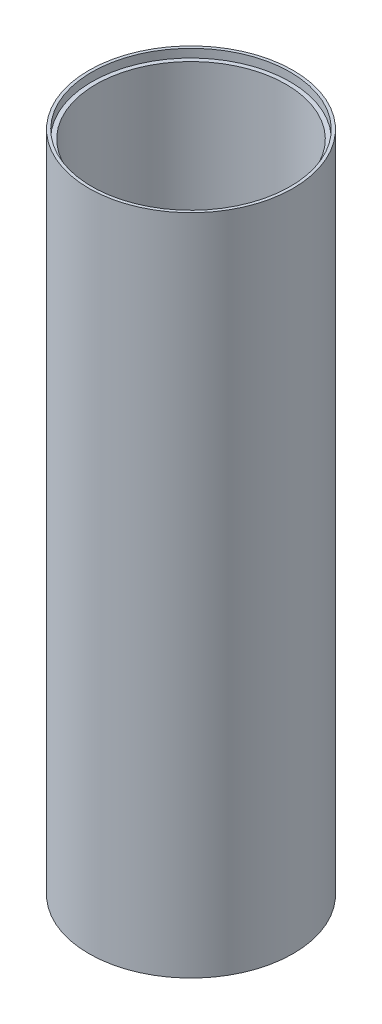
ISO-10303-21;
HEADER;
FILE_DESCRIPTION(('STEP AP214'),'2;1');
FILE_NAME('part.step','',(''),(''),'','','');
FILE_SCHEMA(('AUTOMOTIVE_DESIGN { 1 0 10303 214 1 1 1 1 }'));
ENDSEC;
DATA;
#1=APPLICATION_CONTEXT('core data for automotive mechanical design processes');
#2=APPLICATION_PROTOCOL_DEFINITION('international standard','automotive_design',2000,#1);
#3=PRODUCT_CONTEXT('',#1,'mechanical');
#4=PRODUCT('Part','Part','',(#3));
#5=PRODUCT_RELATED_PRODUCT_CATEGORY('part','',(#4));
#6=PRODUCT_DEFINITION_FORMATION('','',#4);
#7=PRODUCT_DEFINITION_CONTEXT('part definition',#1,'design');
#8=PRODUCT_DEFINITION('design','',#6,#7);
#9=PRODUCT_DEFINITION_SHAPE('','',#8);
#10=(LENGTH_UNIT() NAMED_UNIT(*) SI_UNIT(.MILLI.,.METRE.));
#11=(NAMED_UNIT(*) PLANE_ANGLE_UNIT() SI_UNIT($,.RADIAN.));
#12=(NAMED_UNIT(*) SI_UNIT($,.STERADIAN.) SOLID_ANGLE_UNIT());
#13=UNCERTAINTY_MEASURE_WITH_UNIT(LENGTH_MEASURE(1.E-05),#10,'distance_accuracy_value','');
#14=(GEOMETRIC_REPRESENTATION_CONTEXT(3) GLOBAL_UNCERTAINTY_ASSIGNED_CONTEXT((#13)) GLOBAL_UNIT_ASSIGNED_CONTEXT((#10,
#11,#12)) REPRESENTATION_CONTEXT('',''));
#15=CARTESIAN_POINT('',(0.,0.,0.));
#16=DIRECTION('',(0.,0.,1.));
#17=DIRECTION('',(1.,0.,0.));
#18=AXIS2_PLACEMENT_3D('',#15,#16,#17);
#19=CARTESIAN_POINT('',(0.,0.,0.));
#20=DIRECTION('',(0.,-1.,0.));
#21=DIRECTION('',(0.,0.,-1.));
#22=AXIS2_PLACEMENT_3D('',#19,#20,#21);
#23=PLANE('',#22);
#24=DIRECTION('',(-1.,0.,0.));
#25=VECTOR('',#24,1.);
#26=CARTESIAN_POINT('',(-3.175,0.,-3.175));
#27=LINE('',#26,#25);
#28=CARTESIAN_POINT('',(3.175,0.,-3.175));
#29=VERTEX_POINT('',#28);
#30=CARTESIAN_POINT('',(-3.175,0.,-3.175));
#31=VERTEX_POINT('',#30);
#32=EDGE_CURVE('E118',#29,#31,#27,.T.);
#33=ORIENTED_EDGE('',*,*,#32,.F.);
#34=DIRECTION('',(0.,0.,-1.));
#35=VECTOR('',#34,1.);
#36=CARTESIAN_POINT('',(3.175,0.,3.175));
#37=LINE('',#36,#35);
#38=CARTESIAN_POINT('',(3.175,0.,3.175));
#39=VERTEX_POINT('',#38);
#40=EDGE_CURVE('E58',#39,#29,#37,.T.);
#41=ORIENTED_EDGE('',*,*,#40,.F.);
#42=DIRECTION('',(1.,0.,0.));
#43=VECTOR('',#42,1.);
#44=CARTESIAN_POINT('',(-3.175,0.,3.175));
#45=LINE('',#44,#43);
#46=CARTESIAN_POINT('',(-3.175,0.,3.175));
#47=VERTEX_POINT('',#46);
#48=EDGE_CURVE('E105',#47,#39,#45,.T.);
#49=ORIENTED_EDGE('',*,*,#48,.F.);
#50=DIRECTION('',(0.,0.,1.));
#51=VECTOR('',#50,1.);
#52=CARTESIAN_POINT('',(-3.175,0.,3.175));
#53=LINE('',#52,#51);
#54=EDGE_CURVE('E109',#31,#47,#53,.T.);
#55=ORIENTED_EDGE('',*,*,#54,.F.);
#56=EDGE_LOOP('',(#33,#41,#49,#55));
#57=FACE_BOUND('',#56,.T.);
#58=CARTESIAN_POINT('',(0.,0.,0.));
#59=DIRECTION('',(0.,-1.,0.));
#60=DIRECTION('',(0.,0.,-1.));
#61=AXIS2_PLACEMENT_3D('',#58,#59,#60);
#62=CIRCLE('',#61,28.575);
#63=CARTESIAN_POINT('',(0.,0.,-28.575));
#64=VERTEX_POINT('',#63);
#65=EDGE_CURVE('E11',#64,#64,#62,.T.);
#66=ORIENTED_EDGE('',*,*,#65,.F.);
#67=EDGE_LOOP('',(#66));
#68=FACE_BOUND('',#67,.T.);
#69=ADVANCED_FACE('F43',(#57,#68),#23,.F.);
#70=CARTESIAN_POINT('',(0.,-6.35,0.));
#71=DIRECTION('',(0.,-1.,0.));
#72=DIRECTION('',(0.,0.,-1.));
#73=AXIS2_PLACEMENT_3D('',#70,#71,#72);
#74=CYLINDRICAL_SURFACE('',#73,28.575);
#75=CARTESIAN_POINT('',(0.,190.5,0.));
#76=DIRECTION('',(0.,-1.,0.));
#77=DIRECTION('',(0.,0.,-1.));
#78=AXIS2_PLACEMENT_3D('',#75,#76,#77);
#79=CIRCLE('',#78,28.575);
#80=CARTESIAN_POINT('',(0.,190.5,-28.575));
#81=VERTEX_POINT('',#80);
#82=EDGE_CURVE('E51',#81,#81,#79,.T.);
#83=ORIENTED_EDGE('',*,*,#82,.F.);
#84=EDGE_LOOP('',(#83));
#85=FACE_BOUND('',#84,.T.);
#86=ORIENTED_EDGE('',*,*,#65,.T.);
#87=EDGE_LOOP('',(#86));
#88=FACE_BOUND('',#87,.T.);
#89=ADVANCED_FACE('F153',(#85,#88),#74,.F.);
#90=CARTESIAN_POINT('',(-28.575,190.5,0.));
#91=DIRECTION('',(0.,-1.,0.));
#92=DIRECTION('',(0.,0.,-1.));
#93=AXIS2_PLACEMENT_3D('',#90,#91,#92);
#94=PLANE('',#93);
#95=CARTESIAN_POINT('',(0.,190.5,0.));
#96=DIRECTION('',(0.,-1.,0.));
#97=DIRECTION('',(0.,0.,-1.));
#98=AXIS2_PLACEMENT_3D('',#95,#96,#97);
#99=CIRCLE('',#98,29.845);
#100=CARTESIAN_POINT('',(0.,190.5,-29.845));
#101=VERTEX_POINT('',#100);
#102=EDGE_CURVE('E144',#101,#101,#99,.T.);
#103=ORIENTED_EDGE('',*,*,#102,.F.);
#104=EDGE_LOOP('',(#103));
#105=FACE_BOUND('',#104,.T.);
#106=ORIENTED_EDGE('',*,*,#82,.T.);
#107=EDGE_LOOP('',(#106));
#108=FACE_BOUND('',#107,.T.);
#109=ADVANCED_FACE('F151',(#105,#108),#94,.F.);
#110=CARTESIAN_POINT('',(0.,-6.35,0.));
#111=DIRECTION('',(0.,-1.,0.));
#112=DIRECTION('',(0.,0.,-1.));
#113=AXIS2_PLACEMENT_3D('',#110,#111,#112);
#114=CYLINDRICAL_SURFACE('',#113,29.845);
#115=CARTESIAN_POINT('',(0.,193.04,0.));
#116=DIRECTION('',(0.,-1.,0.));
#117=DIRECTION('',(0.,0.,-1.));
#118=AXIS2_PLACEMENT_3D('',#115,#116,#117);
#119=CIRCLE('',#118,29.845);
#120=CARTESIAN_POINT('',(0.,193.04,-29.845));
#121=VERTEX_POINT('',#120);
#122=EDGE_CURVE('E140',#121,#121,#119,.T.);
#123=ORIENTED_EDGE('',*,*,#122,.F.);
#124=EDGE_LOOP('',(#123));
#125=FACE_BOUND('',#124,.T.);
#126=ORIENTED_EDGE('',*,*,#102,.T.);
#127=EDGE_LOOP('',(#126));
#128=FACE_BOUND('',#127,.T.);
#129=ADVANCED_FACE('F187',(#125,#128),#114,.F.);
#130=CARTESIAN_POINT('',(-29.845,193.04,0.));
#131=DIRECTION('',(0.,-1.,0.));
#132=DIRECTION('',(0.,0.,-1.));
#133=AXIS2_PLACEMENT_3D('',#130,#131,#132);
#134=PLANE('',#133);
#135=CARTESIAN_POINT('',(0.,193.04,0.));
#136=DIRECTION('',(0.,-1.,0.));
#137=DIRECTION('',(0.,0.,-1.));
#138=AXIS2_PLACEMENT_3D('',#135,#136,#137);
#139=CIRCLE('',#138,30.734);
#140=CARTESIAN_POINT('',(0.,193.04,-30.734));
#141=VERTEX_POINT('',#140);
#142=EDGE_CURVE('E136',#141,#141,#139,.T.);
#143=ORIENTED_EDGE('',*,*,#142,.F.);
#144=EDGE_LOOP('',(#143));
#145=FACE_BOUND('',#144,.T.);
#146=ORIENTED_EDGE('',*,*,#122,.T.);
#147=EDGE_LOOP('',(#146));
#148=FACE_BOUND('',#147,.T.);
#149=ADVANCED_FACE('F183',(#145,#148),#134,.F.);
#150=CARTESIAN_POINT('',(0.,-6.35,0.));
#151=DIRECTION('',(0.,-1.,0.));
#152=DIRECTION('',(0.,0.,-1.));
#153=AXIS2_PLACEMENT_3D('',#150,#151,#152);
#154=CYLINDRICAL_SURFACE('',#153,30.734);
#155=CARTESIAN_POINT('',(0.,-6.35,0.));
#156=DIRECTION('',(0.,-1.,0.));
#157=DIRECTION('',(0.,0.,-1.));
#158=AXIS2_PLACEMENT_3D('',#155,#156,#157);
#159=CIRCLE('',#158,30.734);
#160=CARTESIAN_POINT('',(0.,-6.35,-30.734));
#161=VERTEX_POINT('',#160);
#162=EDGE_CURVE('E127',#161,#161,#159,.T.);
#163=ORIENTED_EDGE('',*,*,#162,.F.);
#164=EDGE_LOOP('',(#163));
#165=FACE_BOUND('',#164,.T.);
#166=ORIENTED_EDGE('',*,*,#142,.T.);
#167=EDGE_LOOP('',(#166));
#168=FACE_BOUND('',#167,.T.);
#169=ADVANCED_FACE('F180',(#165,#168),#154,.T.);
#170=CARTESIAN_POINT('',(-30.734,-6.35,0.));
#171=DIRECTION('',(0.,1.,0.));
#172=DIRECTION('',(0.,0.,1.));
#173=AXIS2_PLACEMENT_3D('',#170,#171,#172);
#174=PLANE('',#173);
#175=DIRECTION('',(1.,0.,0.));
#176=VECTOR('',#175,1.);
#177=CARTESIAN_POINT('',(-3.175,-6.35,3.175));
#178=LINE('',#177,#176);
#179=CARTESIAN_POINT('',(-3.175,-6.35,3.175));
#180=VERTEX_POINT('',#179);
#181=CARTESIAN_POINT('',(3.175,-6.35,3.175));
#182=VERTEX_POINT('',#181);
#183=EDGE_CURVE('E93',#180,#182,#178,.T.);
#184=ORIENTED_EDGE('',*,*,#183,.T.);
#185=DIRECTION('',(0.,0.,-1.));
#186=VECTOR('',#185,1.);
#187=CARTESIAN_POINT('',(3.175,-6.35,3.175));
#188=LINE('',#187,#186);
#189=CARTESIAN_POINT('',(3.175,-6.35,-3.175));
#190=VERTEX_POINT('',#189);
#191=EDGE_CURVE('E86',#182,#190,#188,.T.);
#192=ORIENTED_EDGE('',*,*,#191,.T.);
#193=DIRECTION('',(-1.,0.,0.));
#194=VECTOR('',#193,1.);
#195=CARTESIAN_POINT('',(-3.175,-6.35,-3.175));
#196=LINE('',#195,#194);
#197=CARTESIAN_POINT('',(-3.175,-6.35,-3.175));
#198=VERTEX_POINT('',#197);
#199=EDGE_CURVE('E96',#190,#198,#196,.T.);
#200=ORIENTED_EDGE('',*,*,#199,.T.);
#201=DIRECTION('',(0.,0.,1.));
#202=VECTOR('',#201,1.);
#203=CARTESIAN_POINT('',(-3.175,-6.35,3.175));
#204=LINE('',#203,#202);
#205=EDGE_CURVE('E66',#198,#180,#204,.T.);
#206=ORIENTED_EDGE('',*,*,#205,.T.);
#207=EDGE_LOOP('',(#184,#192,#200,#206));
#208=FACE_BOUND('',#207,.T.);
#209=ORIENTED_EDGE('',*,*,#162,.T.);
#210=EDGE_LOOP('',(#209));
#211=FACE_BOUND('',#210,.T.);
#212=ADVANCED_FACE('F101',(#208,#211),#174,.F.);
#213=CARTESIAN_POINT('',(3.175,-6.35,3.175));
#214=DIRECTION('',(1.,0.,0.));
#215=DIRECTION('',(0.,0.,-1.));
#216=AXIS2_PLACEMENT_3D('',#213,#214,#215);
#217=PLANE('',#216);
#218=ORIENTED_EDGE('',*,*,#40,.T.);
#219=DIRECTION('',(0.,1.,0.));
#220=VECTOR('',#219,1.);
#221=CARTESIAN_POINT('',(3.175,-6.35,-3.175));
#222=LINE('',#221,#220);
#223=EDGE_CURVE('E82',#190,#29,#222,.T.);
#224=ORIENTED_EDGE('',*,*,#223,.F.);
#225=ORIENTED_EDGE('',*,*,#191,.F.);
#226=DIRECTION('',(0.,1.,0.));
#227=VECTOR('',#226,1.);
#228=CARTESIAN_POINT('',(3.175,-6.35,3.175));
#229=LINE('',#228,#227);
#230=EDGE_CURVE('E124',#182,#39,#229,.T.);
#231=ORIENTED_EDGE('',*,*,#230,.T.);
#232=EDGE_LOOP('',(#218,#224,#225,#231));
#233=FACE_BOUND('',#232,.T.);
#234=ADVANCED_FACE('F84',(#233),#217,.F.);
#235=CARTESIAN_POINT('',(-3.175,-6.35,3.175));
#236=DIRECTION('',(0.,0.,1.));
#237=DIRECTION('',(1.,0.,0.));
#238=AXIS2_PLACEMENT_3D('',#235,#236,#237);
#239=PLANE('',#238);
#240=ORIENTED_EDGE('',*,*,#48,.T.);
#241=ORIENTED_EDGE('',*,*,#230,.F.);
#242=ORIENTED_EDGE('',*,*,#183,.F.);
#243=DIRECTION('',(0.,1.,0.));
#244=VECTOR('',#243,1.);
#245=CARTESIAN_POINT('',(-3.175,-6.35,3.175));
#246=LINE('',#245,#244);
#247=EDGE_CURVE('E128',#180,#47,#246,.T.);
#248=ORIENTED_EDGE('',*,*,#247,.T.);
#249=EDGE_LOOP('',(#240,#241,#242,#248));
#250=FACE_BOUND('',#249,.T.);
#251=ADVANCED_FACE('F166',(#250),#239,.F.);
#252=CARTESIAN_POINT('',(-3.175,-6.35,3.175));
#253=DIRECTION('',(-1.,0.,0.));
#254=DIRECTION('',(0.,0.,1.));
#255=AXIS2_PLACEMENT_3D('',#252,#253,#254);
#256=PLANE('',#255);
#257=ORIENTED_EDGE('',*,*,#54,.T.);
#258=ORIENTED_EDGE('',*,*,#247,.F.);
#259=ORIENTED_EDGE('',*,*,#205,.F.);
#260=DIRECTION('',(0.,1.,0.));
#261=VECTOR('',#260,1.);
#262=CARTESIAN_POINT('',(-3.175,-6.35,-3.175));
#263=LINE('',#262,#261);
#264=EDGE_CURVE('E92',#198,#31,#263,.T.);
#265=ORIENTED_EDGE('',*,*,#264,.T.);
#266=EDGE_LOOP('',(#257,#258,#259,#265));
#267=FACE_BOUND('',#266,.T.);
#268=ADVANCED_FACE('F164',(#267),#256,.F.);
#269=CARTESIAN_POINT('',(-3.175,-6.35,-3.175));
#270=DIRECTION('',(0.,0.,-1.));
#271=DIRECTION('',(-1.,0.,0.));
#272=AXIS2_PLACEMENT_3D('',#269,#270,#271);
#273=PLANE('',#272);
#274=ORIENTED_EDGE('',*,*,#32,.T.);
#275=ORIENTED_EDGE('',*,*,#264,.F.);
#276=ORIENTED_EDGE('',*,*,#199,.F.);
#277=ORIENTED_EDGE('',*,*,#223,.T.);
#278=EDGE_LOOP('',(#274,#275,#276,#277));
#279=FACE_BOUND('',#278,.T.);
#280=ADVANCED_FACE('F97',(#279),#273,.F.);
#281=CLOSED_SHELL('',(#69,#89,#109,#129,#149,#169,#212,#234,#251,#268,#280));
#282=MANIFOLD_SOLID_BREP('B2',#281);
#283=ADVANCED_BREP_SHAPE_REPRESENTATION('',(#18,#282),#14);
#284=SHAPE_DEFINITION_REPRESENTATION(#9,#283);
ENDSEC;
END-ISO-10303-21;
